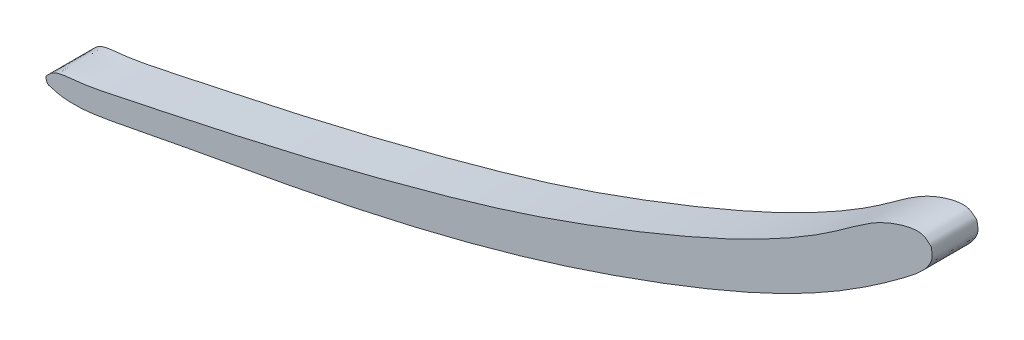
ISO-10303-21;
HEADER;
FILE_DESCRIPTION(('STEP AP214'),'2;1');
FILE_NAME('part.step','',(''),(''),'','','');
FILE_SCHEMA(('AUTOMOTIVE_DESIGN { 1 0 10303 214 1 1 1 1 }'));
ENDSEC;
DATA;
#1=APPLICATION_CONTEXT('core data for automotive mechanical design processes');
#2=APPLICATION_PROTOCOL_DEFINITION('international standard','automotive_design',2000,#1);
#3=PRODUCT_CONTEXT('',#1,'mechanical');
#4=PRODUCT('Part','Part','',(#3));
#5=PRODUCT_RELATED_PRODUCT_CATEGORY('part','',(#4));
#6=PRODUCT_DEFINITION_FORMATION('','',#4);
#7=PRODUCT_DEFINITION_CONTEXT('part definition',#1,'design');
#8=PRODUCT_DEFINITION('design','',#6,#7);
#9=PRODUCT_DEFINITION_SHAPE('','',#8);
#10=(LENGTH_UNIT() NAMED_UNIT(*) SI_UNIT(.MILLI.,.METRE.));
#11=(NAMED_UNIT(*) PLANE_ANGLE_UNIT() SI_UNIT($,.RADIAN.));
#12=(NAMED_UNIT(*) SI_UNIT($,.STERADIAN.) SOLID_ANGLE_UNIT());
#13=UNCERTAINTY_MEASURE_WITH_UNIT(LENGTH_MEASURE(1.E-05),#10,'distance_accuracy_value','');
#14=(GEOMETRIC_REPRESENTATION_CONTEXT(3) GLOBAL_UNCERTAINTY_ASSIGNED_CONTEXT((#13)) GLOBAL_UNIT_ASSIGNED_CONTEXT((#10,
#11,#12)) REPRESENTATION_CONTEXT('',''));
#15=CARTESIAN_POINT('',(0.,0.,0.));
#16=DIRECTION('',(0.,0.,1.));
#17=DIRECTION('',(1.,0.,0.));
#18=AXIS2_PLACEMENT_3D('',#15,#16,#17);
#19=CARTESIAN_POINT('',(91.603836258522,0.,260.));
#20=CARTESIAN_POINT('',(91.5553585518044,0.101876277070272,260.));
#21=CARTESIAN_POINT('',(91.4726470622969,0.178507328536229,260.));
#22=CARTESIAN_POINT('',(91.3025681478447,0.322014638656584,260.));
#23=CARTESIAN_POINT('',(91.2134167914587,0.388567661276925,260.));
#24=CARTESIAN_POINT('',(91.0380392953385,0.52537345109334,260.));
#25=CARTESIAN_POINT('',(90.9513061942287,0.594985025577056,260.));
#26=CARTESIAN_POINT('',(90.7727413402727,0.727759520871505,260.));
#27=CARTESIAN_POINT('',(90.6812637694731,0.791020923807146,260.));
#28=CARTESIAN_POINT('',(90.4934510878068,0.907163638833588,260.));
#29=CARTESIAN_POINT('',(90.3967791249805,0.959858927136439,260.));
#30=CARTESIAN_POINT('',(90.1936831480818,1.04629257377376,260.));
#31=CARTESIAN_POINT('',(90.0865895485178,1.08091350477458,260.));
#32=CARTESIAN_POINT('',(89.7612640002225,1.15975871633576,260.));
#33=CARTESIAN_POINT('',(89.5412703466494,1.17983449784633,260.));
#34=CARTESIAN_POINT('',(89.0982830990387,1.18864761593023,260.));
#35=CARTESIAN_POINT('',(88.8750801211929,1.17631649360539,260.));
#36=CARTESIAN_POINT('',(88.4350141945215,1.13596400587558,260.));
#37=CARTESIAN_POINT('',(88.2167930471731,1.10705660563916,260.));
#38=CARTESIAN_POINT('',(87.5669423457254,0.997141767804648,260.));
#39=CARTESIAN_POINT('',(87.1396612477242,0.895179083959574,260.));
#40=CARTESIAN_POINT('',(86.2908558710251,0.663511555977933,260.));
#41=CARTESIAN_POINT('',(85.8684856029018,0.531377867758049,260.));
#42=CARTESIAN_POINT('',(85.0365490111303,0.241981408095039,260.));
#43=CARTESIAN_POINT('',(84.6269614291081,0.0853232736908565,260.));
#44=CARTESIAN_POINT('',(83.4162546723911,-0.41849497743597,260.));
#45=CARTESIAN_POINT('',(82.6338967586556,-0.800820891518073,260.));
#46=CARTESIAN_POINT('',(80.3578358239991,-2.08090386429679,260.));
#47=CARTESIAN_POINT('',(78.9281907024888,-3.09890644147714,260.));
#48=CARTESIAN_POINT('',(76.7922315693229,-4.64109909780624,260.));
#49=CARTESIAN_POINT('',(76.0805254309011,-5.15567775084203,260.));
#50=CARTESIAN_POINT('',(74.647215014154,-6.16666507766017,260.));
#51=CARTESIAN_POINT('',(73.9262196535863,-6.66419153954495,260.));
#52=CARTESIAN_POINT('',(71.7415395794083,-8.11694734248332,260.));
#53=CARTESIAN_POINT('',(70.2577759456438,-9.03531788317729,260.));
#54=CARTESIAN_POINT('',(67.2539313541827,-10.8053913857253,260.));
#55=CARTESIAN_POINT('',(65.7339342782247,-11.6572483289806,260.));
#56=CARTESIAN_POINT('',(62.6673670106799,-13.312182044229,260.));
#57=CARTESIAN_POINT('',(61.1197352279837,-14.1133100573013,260.));
#58=CARTESIAN_POINT('',(57.99666019437,-15.6645126728546,260.));
#59=CARTESIAN_POINT('',(56.4217154344959,-16.4155023535223,260.));
#60=CARTESIAN_POINT('',(51.6656266322858,-18.6110975826145,260.));
#61=CARTESIAN_POINT('',(48.4540527677881,-20.0028662392139,260.));
#62=CARTESIAN_POINT('',(41.9868685724657,-22.6917688499962,260.));
#63=CARTESIAN_POINT('',(38.7321761446175,-23.985719953274,260.));
#64=CARTESIAN_POINT('',(32.1922284411193,-26.4901186043719,260.));
#65=CARTESIAN_POINT('',(28.9067714510636,-27.6996602800699,260.));
#66=CARTESIAN_POINT('',(22.29386927839,-30.003061811623,260.));
#67=CARTESIAN_POINT('',(18.9651562144002,-31.0951726735387,260.));
#68=CARTESIAN_POINT('',(12.2737520883989,-33.1585478402287,260.));
#69=CARTESIAN_POINT('',(8.9109287141975,-34.1330884779762,260.));
#70=CARTESIAN_POINT('',(2.16433546632563,-36.0122552211328,260.));
#71=CARTESIAN_POINT('',(-1.21823951831603,-36.9190487729415,260.));
#72=CARTESIAN_POINT('',(-7.99377008797927,-38.6904853774885,260.));
#73=CARTESIAN_POINT('',(-11.3878770980222,-39.5525132430664,260.));
#74=CARTESIAN_POINT('',(-18.1901195317249,-41.2201608464503,260.));
#75=CARTESIAN_POINT('',(-21.5983426849863,-42.0234444809931,260.));
#76=CARTESIAN_POINT('',(-28.4265325887207,-43.5795112385184,260.));
#77=CARTESIAN_POINT('',(-31.846677875781,-44.3317505363531,260.));
#78=CARTESIAN_POINT('',(-38.6914308882597,-45.8152862451121,260.));
#79=CARTESIAN_POINT('',(-42.1155779386966,-46.5488809566157,260.));
#80=CARTESIAN_POINT('',(-47.2537007801646,-47.6402778653854,260.));
#81=CARTESIAN_POINT('',(-48.9670775031458,-48.0009487385288,260.));
#82=CARTESIAN_POINT('',(-51.5388406702404,-48.5337516291482,260.));
#83=CARTESIAN_POINT('',(-52.3959335580973,-48.7121346944139,260.));
#84=CARTESIAN_POINT('',(-54.1125932882337,-49.0569202060549,260.));
#85=CARTESIAN_POINT('',(-54.9722590243259,-49.2202585098037,260.));
#86=CARTESIAN_POINT('',(-56.267430463406,-49.4258659589171,260.));
#87=CARTESIAN_POINT('',(-56.7000555426299,-49.4881646013151,260.));
#88=CARTESIAN_POINT('',(-57.567349859171,-49.5986153779034,260.));
#89=CARTESIAN_POINT('',(-58.002207816876,-49.6454614807633,260.));
#90=CARTESIAN_POINT('',(-58.8734421608677,-49.7286454667595,260.));
#91=CARTESIAN_POINT('',(-59.3094527937195,-49.7675145308184,260.));
#92=CARTESIAN_POINT('',(-60.1762826278142,-49.8811797382091,260.));
#93=CARTESIAN_POINT('',(-60.6081723134399,-49.9519039505424,260.));
#94=CARTESIAN_POINT('',(-61.2346779025629,-50.1278288154511,260.));
#95=CARTESIAN_POINT('',(-61.4399817291502,-50.1987998389035,260.));
#96=CARTESIAN_POINT('',(-61.739040541294,-50.3363190504988,260.));
#97=CARTESIAN_POINT('',(-61.8375466134454,-50.3876488901678,260.));
#98=CARTESIAN_POINT('',(-62.0259274634728,-50.5003672691711,260.));
#99=CARTESIAN_POINT('',(-62.1161193302079,-50.5622940988439,260.));
#100=CARTESIAN_POINT('',(-62.3782811667627,-50.7597900125803,260.));
#101=CARTESIAN_POINT('',(-62.5412291247319,-50.9085023512483,260.));
#102=CARTESIAN_POINT('',(-62.7780426113806,-51.1388034835041,260.));
#103=CARTESIAN_POINT('',(-62.8572479965772,-51.2153888116601,260.));
#104=CARTESIAN_POINT('',(-63.0046313265782,-51.3793807913512,260.));
#105=CARTESIAN_POINT('',(-63.075782681716,-51.4674500860984,260.));
#106=CARTESIAN_POINT('',(-63.1493668734531,-51.6735309900859,260.));
#107=CARTESIAN_POINT('',(-63.1453686816869,-51.7893203649949,260.));
#108=CARTESIAN_POINT('',(-63.1050802115201,-52.0045040235876,260.));
#109=CARTESIAN_POINT('',(-63.0728044747056,-52.1085069462364,260.));
#110=CARTESIAN_POINT('',(-62.9987354680191,-52.3136971848258,260.));
#111=CARTESIAN_POINT('',(-62.9554251314759,-52.4162843117688,260.));
#112=CARTESIAN_POINT('',(-62.8575639025905,-52.5480475956651,260.));
#113=CARTESIAN_POINT('',(-62.818407904005,-52.588062997603,260.));
#114=CARTESIAN_POINT('',(-62.7309934265951,-52.6535691633698,260.));
#115=CARTESIAN_POINT('',(-62.6809603164591,-52.6790654764105,260.));
#116=CARTESIAN_POINT('',(-62.5281491432617,-52.7367248404464,260.));
#117=CARTESIAN_POINT('',(-62.4213118287148,-52.7568258759354,260.));
#118=CARTESIAN_POINT('',(-62.2091023536071,-52.8024415491737,260.));
#119=CARTESIAN_POINT('',(-62.1034506466019,-52.8267966587884,260.));
#120=CARTESIAN_POINT('',(-61.7880793535659,-52.9072734819214,260.));
#121=CARTESIAN_POINT('',(-61.5791157508863,-52.9670432787308,260.));
#122=CARTESIAN_POINT('',(-61.1599200267986,-53.0805377147515,260.));
#123=CARTESIAN_POINT('',(-60.9491966074234,-53.1319210612623,260.));
#124=CARTESIAN_POINT('',(-60.5234131733857,-53.2140216014183,260.));
#125=CARTESIAN_POINT('',(-60.3086879846683,-53.2463344164454,260.));
#126=CARTESIAN_POINT('',(-59.6605392451748,-53.3243386049996,260.));
#127=CARTESIAN_POINT('',(-59.2258278689746,-53.3507904113598,260.));
#128=CARTESIAN_POINT('',(-57.9299010409486,-53.3915348914194,260.));
#129=CARTESIAN_POINT('',(-57.0700949668366,-53.3585259948166,260.));
#130=CARTESIAN_POINT('',(-55.3564726846759,-53.2055579118124,260.));
#131=CARTESIAN_POINT('',(-54.5025142183904,-53.0876637790834,260.));
#132=CARTESIAN_POINT('',(-52.7969514844708,-52.8177014181059,260.));
#133=CARTESIAN_POINT('',(-51.9456787675898,-52.6640178360964,260.));
#134=CARTESIAN_POINT('',(-49.397470783285,-52.1845733950714,260.));
#135=CARTESIAN_POINT('',(-47.7027390428147,-51.8435708649781,260.));
#136=CARTESIAN_POINT('',(-44.3097292692642,-51.1801721712808,260.));
#137=CARTESIAN_POINT('',(-42.6120397629021,-50.8546881790594,260.));
#138=CARTESIAN_POINT('',(-37.5142999296016,-49.9027452302228,260.));
#139=CARTESIAN_POINT('',(-34.1111928029328,-49.2927292443907,260.));
#140=CARTESIAN_POINT('',(-27.3076522263526,-48.0589398120599,260.));
#141=CARTESIAN_POINT('',(-23.9073483617419,-47.434593588802,260.));
#142=CARTESIAN_POINT('',(-13.7217019276446,-45.4839863093402,260.));
#143=CARTESIAN_POINT('',(-6.94989037654474,-44.0789196979219,260.));
#144=CARTESIAN_POINT('',(6.51934767856484,-40.9412584074609,260.));
#145=CARTESIAN_POINT('',(13.2170629941064,-39.2112977805989,260.));
#146=CARTESIAN_POINT('',(26.4935746536717,-35.336864175956,260.));
#147=CARTESIAN_POINT('',(33.0722954012052,-33.1905428370405,260.));
#148=CARTESIAN_POINT('',(42.8318843702323,-29.6878008941784,260.));
#149=CARTESIAN_POINT('',(46.0670644055581,-28.4745162783022,260.));
#150=CARTESIAN_POINT('',(52.4956612980625,-25.9420016374926,260.));
#151=CARTESIAN_POINT('',(55.6892706597814,-24.6232599607452,260.));
#152=CARTESIAN_POINT('',(62.0163099166235,-21.8331125024531,260.));
#153=CARTESIAN_POINT('',(65.148483938518,-20.3600071933936,260.));
#154=CARTESIAN_POINT('',(71.2945715196597,-17.1911347773583,260.));
#155=CARTESIAN_POINT('',(74.3116209595769,-15.4910144210044,260.));
#156=CARTESIAN_POINT('',(80.1838009414457,-11.8340938368323,260.));
#157=CARTESIAN_POINT('',(83.0426082798863,-9.87895734802884,260.));
#158=CARTESIAN_POINT('',(86.5267256046673,-7.31620974576604,260.));
#159=CARTESIAN_POINT('',(87.2194999297452,-6.79765962592061,260.));
#160=CARTESIAN_POINT('',(88.2403049087728,-5.99695055266286,260.));
#161=CARTESIAN_POINT('',(88.5768026775404,-5.72535447894867,260.));
#162=CARTESIAN_POINT('',(89.2371592200492,-5.1664311231995,260.));
#163=CARTESIAN_POINT('',(89.561650125352,-4.87981019837448,260.));
#164=CARTESIAN_POINT('',(90.1803367275688,-4.27983875891567,260.));
#165=CARTESIAN_POINT('',(90.475062460005,-3.96629575505175,260.));
#166=CARTESIAN_POINT('',(91.0140515070829,-3.29240761822194,260.));
#167=CARTESIAN_POINT('',(91.25800347187,-2.9272625751099,260.));
#168=CARTESIAN_POINT('',(91.5475017264035,-2.34612903035034,260.));
#169=CARTESIAN_POINT('',(91.6324902285912,-2.14559489830917,260.));
#170=CARTESIAN_POINT('',(91.7590293141033,-1.72742997018341,260.));
#171=CARTESIAN_POINT('',(91.8003203645713,-1.51477585399613,260.));
#172=CARTESIAN_POINT('',(91.8017586935442,-1.07628121548826,260.));
#173=CARTESIAN_POINT('',(91.7588449962305,-0.859549427443122,260.));
#174=CARTESIAN_POINT('',(91.7013661531637,-0.535919042209292,260.));
#175=CARTESIAN_POINT('',(91.6871063658217,-0.427378367320669,260.));
#176=CARTESIAN_POINT('',(91.6672772101172,-0.264355918697693,260.));
#177=CARTESIAN_POINT('',(91.6610859136702,-0.209836721273731,260.));
#178=CARTESIAN_POINT('',(91.6414124677293,-0.1026477030091,260.));
#179=CARTESIAN_POINT('',(91.6280751118808,-0.0509381385351262,260.));
#180=CARTESIAN_POINT('',(91.603836258522,0.,260.));
#181=B_SPLINE_CURVE_WITH_KNOTS('',3,(#19,#20,#21,#22,#23,#24,#25,#26,#27,#28,#29,#30,#31,#32,
#33,#34,#35,#36,#37,#38,#39,#40,#41,#42,#43,#44,#45,#46,#47,#48,#49,#50,#51,#52,#53,#54,#55,#56,
#57,#58,#59,#60,#61,#62,#63,#64,#65,#66,#67,#68,#69,#70,#71,#72,#73,#74,#75,#76,#77,#78,#79,#80,
#81,#82,#83,#84,#85,#86,#87,#88,#89,#90,#91,#92,#93,#94,#95,#96,#97,#98,#99,#100,#101,#102,#103,
#104,#105,#106,#107,#108,#109,#110,#111,#112,#113,#114,#115,#116,#117,#118,#119,#120,#121,#122,
#123,#124,#125,#126,#127,#128,#129,#130,#131,#132,#133,#134,#135,#136,#137,#138,#139,#140,#141,
#142,#143,#144,#145,#146,#147,#148,#149,#150,#151,#152,#153,#154,#155,#156,#157,#158,#159,#160,
#161,#162,#163,#164,#165,#166,#167,#168,#169,#170,#171,#172,#173,#174,#175,#176,#177,#178,#179,
#180),.UNSPECIFIED.,.T.,.F.,(4,2,2,2,2,2,2,2,2,2,2,2,2,2,2,2,2,2,2,2,2,2,2,2,2,2,2,2,2,2,2,2,2,
2,2,2,2,2,2,2,2,2,2,2,2,2,2,2,2,2,2,2,2,2,2,2,2,2,2,2,2,2,2,2,2,2,2,2,2,2,2,2,2,2,2,2,2,2,2,2,
4),(0.,0.000976562500000093,0.00195312500000019,0.00292968750000028,0.00390625000000037,
0.00488281250000046,0.00585937500000056,0.00781250000000063,0.00976562500000069,
0.0117187500000008,0.0156250000000009,0.019531250000001,0.0234375000000012,0.0312500000000013,
0.0468750000000016,0.0546875000000018,0.062500000000002,0.0781250000000023,0.0937500000000026,
0.109375000000003,0.125000000000003,0.156250000000004,0.187500000000005,0.218750000000005,
0.250000000000006,0.281250000000007,0.312500000000008,0.343750000000008,0.375000000000009,
0.40625000000001,0.437500000000011,0.453125000000011,0.460937500000011,0.468750000000011,
0.472656250000011,0.476562500000012,0.480468750000012,0.484375000000012,0.486328125000012,
0.487304687500012,0.488281250000012,0.490234375000012,0.491210937500012,0.492187500000012,
0.493164062500012,0.494140625000012,0.495117187500012,0.495605468750012,0.496093750000012,
0.497070312500012,0.498046875000012,0.500000000000012,0.501953125000012,0.503906250000012,
0.507812500000012,0.515625000000011,0.523437500000011,0.531250000000011,0.546875000000011,
0.562500000000011,0.59375000000001,0.625000000000009,0.687500000000008,0.750000000000006,
0.812500000000005,0.843750000000004,0.875000000000003,0.906250000000002,0.937500000000002,
0.968750000000001,0.976562500000001,0.980468750000001,0.984375000000001,0.98828125,0.9921875,
0.994140625,0.99609375,0.998046875,0.9990234375,0.99951171875,1.),.UNSPECIFIED.);
#182=DIRECTION('',(0.,0.,-1.));
#183=VECTOR('',#182,1.);
#184=SURFACE_OF_LINEAR_EXTRUSION('',#181,#183);
#185=CARTESIAN_POINT('',(91.603836258522,0.,260.));
#186=CARTESIAN_POINT('',(91.6280751118808,-0.0509381385351262,260.));
#187=CARTESIAN_POINT('',(91.6414124677293,-0.1026477030091,260.));
#188=CARTESIAN_POINT('',(91.6610859136702,-0.209836721273731,260.));
#189=CARTESIAN_POINT('',(91.6672772101172,-0.264355918697693,260.));
#190=CARTESIAN_POINT('',(91.6871063658217,-0.427378367320669,260.));
#191=CARTESIAN_POINT('',(91.7013661531637,-0.535919042209292,260.));
#192=CARTESIAN_POINT('',(91.7588449962305,-0.859549427443122,260.));
#193=CARTESIAN_POINT('',(91.8017586935442,-1.07628121548826,260.));
#194=CARTESIAN_POINT('',(91.8003203645713,-1.51477585399613,260.));
#195=CARTESIAN_POINT('',(91.7590293141033,-1.72742997018341,260.));
#196=CARTESIAN_POINT('',(91.6324902285912,-2.14559489830917,260.));
#197=CARTESIAN_POINT('',(91.5475017264035,-2.34612903035034,260.));
#198=CARTESIAN_POINT('',(91.25800347187,-2.9272625751099,260.));
#199=CARTESIAN_POINT('',(91.0140515070829,-3.29240761822194,260.));
#200=CARTESIAN_POINT('',(90.475062460005,-3.96629575505175,260.));
#201=CARTESIAN_POINT('',(90.1803367275688,-4.27983875891567,260.));
#202=CARTESIAN_POINT('',(89.561650125352,-4.87981019837448,260.));
#203=CARTESIAN_POINT('',(89.2371592200492,-5.1664311231995,260.));
#204=CARTESIAN_POINT('',(88.5768026775404,-5.72535447894867,260.));
#205=CARTESIAN_POINT('',(88.2403049087728,-5.99695055266286,260.));
#206=CARTESIAN_POINT('',(87.2194999297452,-6.79765962592061,260.));
#207=CARTESIAN_POINT('',(86.5267256046673,-7.31620974576604,260.));
#208=CARTESIAN_POINT('',(83.0426082798863,-9.87895734802884,260.));
#209=CARTESIAN_POINT('',(80.1838009414457,-11.8340938368323,260.));
#210=CARTESIAN_POINT('',(74.3116209595769,-15.4910144210044,260.));
#211=CARTESIAN_POINT('',(71.2945715196597,-17.1911347773583,260.));
#212=CARTESIAN_POINT('',(65.148483938518,-20.3600071933936,260.));
#213=CARTESIAN_POINT('',(62.0163099166235,-21.8331125024531,260.));
#214=CARTESIAN_POINT('',(55.6892706597814,-24.6232599607452,260.));
#215=CARTESIAN_POINT('',(52.4956612980625,-25.9420016374926,260.));
#216=CARTESIAN_POINT('',(46.0670644055581,-28.4745162783022,260.));
#217=CARTESIAN_POINT('',(42.8318843702323,-29.6878008941784,260.));
#218=CARTESIAN_POINT('',(33.0722954012052,-33.1905428370405,260.));
#219=CARTESIAN_POINT('',(26.4935746536717,-35.336864175956,260.));
#220=CARTESIAN_POINT('',(13.2170629941064,-39.2112977805989,260.));
#221=CARTESIAN_POINT('',(6.51934767856484,-40.9412584074609,260.));
#222=CARTESIAN_POINT('',(-6.94989037654474,-44.0789196979219,260.));
#223=CARTESIAN_POINT('',(-13.7217019276446,-45.4839863093402,260.));
#224=CARTESIAN_POINT('',(-23.9073483617419,-47.434593588802,260.));
#225=CARTESIAN_POINT('',(-27.3076522263526,-48.0589398120599,260.));
#226=CARTESIAN_POINT('',(-34.1111928029328,-49.2927292443907,260.));
#227=CARTESIAN_POINT('',(-37.5142999296016,-49.9027452302228,260.));
#228=CARTESIAN_POINT('',(-42.6120397629021,-50.8546881790594,260.));
#229=CARTESIAN_POINT('',(-44.3097292692642,-51.1801721712808,260.));
#230=CARTESIAN_POINT('',(-47.7027390428147,-51.8435708649781,260.));
#231=CARTESIAN_POINT('',(-49.397470783285,-52.1845733950714,260.));
#232=CARTESIAN_POINT('',(-51.9456787675898,-52.6640178360964,260.));
#233=CARTESIAN_POINT('',(-52.7969514844708,-52.8177014181059,260.));
#234=CARTESIAN_POINT('',(-54.5025142183904,-53.0876637790834,260.));
#235=CARTESIAN_POINT('',(-55.3564726846759,-53.2055579118124,260.));
#236=CARTESIAN_POINT('',(-57.0700949668366,-53.3585259948166,260.));
#237=CARTESIAN_POINT('',(-57.9299010409486,-53.3915348914194,260.));
#238=CARTESIAN_POINT('',(-59.2258278689746,-53.3507904113598,260.));
#239=CARTESIAN_POINT('',(-59.6605392451748,-53.3243386049996,260.));
#240=CARTESIAN_POINT('',(-60.3086879846683,-53.2463344164454,260.));
#241=CARTESIAN_POINT('',(-60.5234131733857,-53.2140216014183,260.));
#242=CARTESIAN_POINT('',(-60.9491966074234,-53.1319210612623,260.));
#243=CARTESIAN_POINT('',(-61.1599200267986,-53.0805377147515,260.));
#244=CARTESIAN_POINT('',(-61.5791157508863,-52.9670432787308,260.));
#245=CARTESIAN_POINT('',(-61.7880793535659,-52.9072734819214,260.));
#246=CARTESIAN_POINT('',(-62.1034506466019,-52.8267966587884,260.));
#247=CARTESIAN_POINT('',(-62.2091023536071,-52.8024415491737,260.));
#248=CARTESIAN_POINT('',(-62.4213118287148,-52.7568258759354,260.));
#249=CARTESIAN_POINT('',(-62.5281491432617,-52.7367248404464,260.));
#250=CARTESIAN_POINT('',(-62.6809603164591,-52.6790654764105,260.));
#251=CARTESIAN_POINT('',(-62.7309934265951,-52.6535691633698,260.));
#252=CARTESIAN_POINT('',(-62.818407904005,-52.588062997603,260.));
#253=CARTESIAN_POINT('',(-62.8575639025905,-52.5480475956651,260.));
#254=CARTESIAN_POINT('',(-62.9554251314759,-52.4162843117688,260.));
#255=CARTESIAN_POINT('',(-62.9987354680191,-52.3136971848258,260.));
#256=CARTESIAN_POINT('',(-63.0728044747056,-52.1085069462364,260.));
#257=CARTESIAN_POINT('',(-63.1050802115201,-52.0045040235876,260.));
#258=CARTESIAN_POINT('',(-63.1453686816869,-51.7893203649949,260.));
#259=CARTESIAN_POINT('',(-63.1493668734531,-51.6735309900859,260.));
#260=CARTESIAN_POINT('',(-63.075782681716,-51.4674500860984,260.));
#261=CARTESIAN_POINT('',(-63.0046313265782,-51.3793807913512,260.));
#262=CARTESIAN_POINT('',(-62.8572479965772,-51.2153888116601,260.));
#263=CARTESIAN_POINT('',(-62.7780426113806,-51.1388034835041,260.));
#264=CARTESIAN_POINT('',(-62.5412291247319,-50.9085023512483,260.));
#265=CARTESIAN_POINT('',(-62.3782811667627,-50.7597900125803,260.));
#266=CARTESIAN_POINT('',(-62.1161193302079,-50.5622940988439,260.));
#267=CARTESIAN_POINT('',(-62.0259274634728,-50.5003672691711,260.));
#268=CARTESIAN_POINT('',(-61.8375466134454,-50.3876488901678,260.));
#269=CARTESIAN_POINT('',(-61.739040541294,-50.3363190504988,260.));
#270=CARTESIAN_POINT('',(-61.4399817291502,-50.1987998389035,260.));
#271=CARTESIAN_POINT('',(-61.2346779025629,-50.1278288154511,260.));
#272=CARTESIAN_POINT('',(-60.6081723134399,-49.9519039505424,260.));
#273=CARTESIAN_POINT('',(-60.1762826278142,-49.8811797382091,260.));
#274=CARTESIAN_POINT('',(-59.3094527937195,-49.7675145308184,260.));
#275=CARTESIAN_POINT('',(-58.8734421608677,-49.7286454667595,260.));
#276=CARTESIAN_POINT('',(-58.002207816876,-49.6454614807633,260.));
#277=CARTESIAN_POINT('',(-57.567349859171,-49.5986153779034,260.));
#278=CARTESIAN_POINT('',(-56.7000555426299,-49.4881646013151,260.));
#279=CARTESIAN_POINT('',(-56.267430463406,-49.4258659589171,260.));
#280=CARTESIAN_POINT('',(-54.9722590243259,-49.2202585098037,260.));
#281=CARTESIAN_POINT('',(-54.1125932882337,-49.0569202060549,260.));
#282=CARTESIAN_POINT('',(-52.3959335580973,-48.7121346944139,260.));
#283=CARTESIAN_POINT('',(-51.5388406702404,-48.5337516291482,260.));
#284=CARTESIAN_POINT('',(-48.9670775031458,-48.0009487385288,260.));
#285=CARTESIAN_POINT('',(-47.2537007801646,-47.6402778653854,260.));
#286=CARTESIAN_POINT('',(-42.1155779386966,-46.5488809566157,260.));
#287=CARTESIAN_POINT('',(-38.6914308882597,-45.8152862451121,260.));
#288=CARTESIAN_POINT('',(-31.846677875781,-44.3317505363531,260.));
#289=CARTESIAN_POINT('',(-28.4265325887207,-43.5795112385184,260.));
#290=CARTESIAN_POINT('',(-21.5983426849863,-42.0234444809931,260.));
#291=CARTESIAN_POINT('',(-18.1901195317249,-41.2201608464503,260.));
#292=CARTESIAN_POINT('',(-11.3878770980222,-39.5525132430664,260.));
#293=CARTESIAN_POINT('',(-7.99377008797927,-38.6904853774885,260.));
#294=CARTESIAN_POINT('',(-1.21823951831603,-36.9190487729415,260.));
#295=CARTESIAN_POINT('',(2.16433546632563,-36.0122552211328,260.));
#296=CARTESIAN_POINT('',(8.9109287141975,-34.1330884779762,260.));
#297=CARTESIAN_POINT('',(12.2737520883989,-33.1585478402287,260.));
#298=CARTESIAN_POINT('',(18.9651562144002,-31.0951726735387,260.));
#299=CARTESIAN_POINT('',(22.29386927839,-30.003061811623,260.));
#300=CARTESIAN_POINT('',(28.9067714510636,-27.6996602800699,260.));
#301=CARTESIAN_POINT('',(32.1922284411193,-26.4901186043719,260.));
#302=CARTESIAN_POINT('',(38.7321761446175,-23.985719953274,260.));
#303=CARTESIAN_POINT('',(41.9868685724657,-22.6917688499962,260.));
#304=CARTESIAN_POINT('',(48.4540527677881,-20.0028662392139,260.));
#305=CARTESIAN_POINT('',(51.6656266322858,-18.6110975826145,260.));
#306=CARTESIAN_POINT('',(56.4217154344959,-16.4155023535223,260.));
#307=CARTESIAN_POINT('',(57.99666019437,-15.6645126728546,260.));
#308=CARTESIAN_POINT('',(61.1197352279837,-14.1133100573013,260.));
#309=CARTESIAN_POINT('',(62.6673670106799,-13.312182044229,260.));
#310=CARTESIAN_POINT('',(65.7339342782247,-11.6572483289806,260.));
#311=CARTESIAN_POINT('',(67.2539313541827,-10.8053913857253,260.));
#312=CARTESIAN_POINT('',(70.2577759456438,-9.03531788317729,260.));
#313=CARTESIAN_POINT('',(71.7415395794083,-8.11694734248332,260.));
#314=CARTESIAN_POINT('',(73.9262196535863,-6.66419153954495,260.));
#315=CARTESIAN_POINT('',(74.647215014154,-6.16666507766017,260.));
#316=CARTESIAN_POINT('',(76.0805254309011,-5.15567775084203,260.));
#317=CARTESIAN_POINT('',(76.7922315693229,-4.64109909780624,260.));
#318=CARTESIAN_POINT('',(78.9281907024888,-3.09890644147714,260.));
#319=CARTESIAN_POINT('',(80.3578358239991,-2.08090386429679,260.));
#320=CARTESIAN_POINT('',(82.6338967586556,-0.800820891518073,260.));
#321=CARTESIAN_POINT('',(83.4162546723911,-0.41849497743597,260.));
#322=CARTESIAN_POINT('',(84.6269614291081,0.0853232736908565,260.));
#323=CARTESIAN_POINT('',(85.0365490111303,0.241981408095039,260.));
#324=CARTESIAN_POINT('',(85.8684856029018,0.531377867758049,260.));
#325=CARTESIAN_POINT('',(86.2908558710251,0.663511555977933,260.));
#326=CARTESIAN_POINT('',(87.1396612477242,0.895179083959574,260.));
#327=CARTESIAN_POINT('',(87.5669423457254,0.997141767804648,260.));
#328=CARTESIAN_POINT('',(88.2167930471731,1.10705660563916,260.));
#329=CARTESIAN_POINT('',(88.4350141945215,1.13596400587558,260.));
#330=CARTESIAN_POINT('',(88.8750801211929,1.17631649360539,260.));
#331=CARTESIAN_POINT('',(89.0982830990387,1.18864761593023,260.));
#332=CARTESIAN_POINT('',(89.5412703466494,1.17983449784633,260.));
#333=CARTESIAN_POINT('',(89.7612640002225,1.15975871633576,260.));
#334=CARTESIAN_POINT('',(90.0865895485178,1.08091350477458,260.));
#335=CARTESIAN_POINT('',(90.1936831480818,1.04629257377376,260.));
#336=CARTESIAN_POINT('',(90.3967791249805,0.959858927136439,260.));
#337=CARTESIAN_POINT('',(90.4934510878068,0.907163638833588,260.));
#338=CARTESIAN_POINT('',(90.6812637694731,0.791020923807146,260.));
#339=CARTESIAN_POINT('',(90.7727413402727,0.727759520871505,260.));
#340=CARTESIAN_POINT('',(90.9513061942287,0.594985025577056,260.));
#341=CARTESIAN_POINT('',(91.0380392953385,0.52537345109334,260.));
#342=CARTESIAN_POINT('',(91.2134167914587,0.388567661276925,260.));
#343=CARTESIAN_POINT('',(91.3025681478447,0.322014638656584,260.));
#344=CARTESIAN_POINT('',(91.4726470622969,0.178507328536229,260.));
#345=CARTESIAN_POINT('',(91.5553585518044,0.101876277070272,260.));
#346=CARTESIAN_POINT('',(91.603836258522,0.,260.));
#347=B_SPLINE_CURVE_WITH_KNOTS('',3,(#185,#186,#187,#188,#189,#190,#191,#192,#193,#194,#195,
#196,#197,#198,#199,#200,#201,#202,#203,#204,#205,#206,#207,#208,#209,#210,#211,#212,#213,#214,
#215,#216,#217,#218,#219,#220,#221,#222,#223,#224,#225,#226,#227,#228,#229,#230,#231,#232,#233,
#234,#235,#236,#237,#238,#239,#240,#241,#242,#243,#244,#245,#246,#247,#248,#249,#250,#251,#252,
#253,#254,#255,#256,#257,#258,#259,#260,#261,#262,#263,#264,#265,#266,#267,#268,#269,#270,#271,
#272,#273,#274,#275,#276,#277,#278,#279,#280,#281,#282,#283,#284,#285,#286,#287,#288,#289,#290,
#291,#292,#293,#294,#295,#296,#297,#298,#299,#300,#301,#302,#303,#304,#305,#306,#307,#308,#309,
#310,#311,#312,#313,#314,#315,#316,#317,#318,#319,#320,#321,#322,#323,#324,#325,#326,#327,#328,
#329,#330,#331,#332,#333,#334,#335,#336,#337,#338,#339,#340,#341,#342,#343,#344,#345,#346),
.UNSPECIFIED.,.T.,.F.,(4,2,2,2,2,2,2,2,2,2,2,2,2,2,2,2,2,2,2,2,2,2,2,2,2,2,2,2,2,2,2,2,2,2,2,2,
2,2,2,2,2,2,2,2,2,2,2,2,2,2,2,2,2,2,2,2,2,2,2,2,2,2,2,2,2,2,2,2,2,2,2,2,2,2,2,2,2,2,2,2,4),(0.,
0.000488281249999778,0.000976562499999778,0.00195312499999978,0.00390624999999967,
0.00585937499999967,0.00781249999999967,0.0117187499999996,0.0156249999999994,
0.0195312499999994,0.0234374999999993,0.0312499999999992,0.0624999999999984,0.0937499999999976,
0.124999999999997,0.156249999999996,0.187499999999995,0.249999999999994,0.312499999999992,
0.374999999999991,0.40624999999999,0.437499999999989,0.453124999999989,0.468749999999989,
0.476562499999989,0.484374999999989,0.492187499999988,0.496093749999988,0.498046874999988,
0.499999999999988,0.501953124999988,0.502929687499988,0.503906249999988,0.504394531249988,
0.504882812499988,0.505859374999988,0.506835937499988,0.507812499999988,0.508789062499988,
0.509765624999988,0.511718749999988,0.512695312499988,0.513671874999988,0.515624999999988,
0.519531249999988,0.523437499999988,0.527343749999989,0.531249999999989,0.539062499999989,
0.546874999999989,0.562499999999989,0.59374999999999,0.624999999999991,0.656249999999992,
0.687499999999992,0.718749999999993,0.749999999999994,0.781249999999995,0.812499999999995,
0.843749999999996,0.874999999999997,0.890624999999997,0.906249999999997,0.921874999999998,
0.937499999999998,0.945312499999998,0.953124999999998,0.968749999999999,0.976562499999999,
0.980468749999999,0.984374999999999,0.988281249999999,0.990234374999999,0.992187499999999,
0.994140624999999,0.9951171875,0.99609375,0.9970703125,0.998046875,0.9990234375,1.),.UNSPECIFIED.);
#348=CARTESIAN_POINT('',(91.603836258522,0.,260.));
#349=VERTEX_POINT('',#348);
#350=EDGE_CURVE('E10',#349,#349,#347,.F.);
#351=ORIENTED_EDGE('',*,*,#350,.F.);
#352=EDGE_LOOP('',(#351));
#353=FACE_BOUND('',#352,.T.);
#354=CARTESIAN_POINT('',(91.603836258522,0.,252.));
#355=CARTESIAN_POINT('',(91.5553585518044,0.101876277070272,252.));
#356=CARTESIAN_POINT('',(91.4726470622969,0.178507328536229,252.));
#357=CARTESIAN_POINT('',(91.3025681478447,0.322014638656584,252.));
#358=CARTESIAN_POINT('',(91.2134167914587,0.388567661276925,252.));
#359=CARTESIAN_POINT('',(91.0380392953385,0.52537345109334,252.));
#360=CARTESIAN_POINT('',(90.9513061942287,0.594985025577056,252.));
#361=CARTESIAN_POINT('',(90.7727413402727,0.727759520871505,252.));
#362=CARTESIAN_POINT('',(90.6812637694731,0.791020923807146,252.));
#363=CARTESIAN_POINT('',(90.4934510878068,0.907163638833588,252.));
#364=CARTESIAN_POINT('',(90.3967791249805,0.959858927136439,252.));
#365=CARTESIAN_POINT('',(90.1936831480818,1.04629257377376,252.));
#366=CARTESIAN_POINT('',(90.0865895485178,1.08091350477458,252.));
#367=CARTESIAN_POINT('',(89.7612640002225,1.15975871633576,252.));
#368=CARTESIAN_POINT('',(89.5412703466494,1.17983449784633,252.));
#369=CARTESIAN_POINT('',(89.0982830990387,1.18864761593023,252.));
#370=CARTESIAN_POINT('',(88.8750801211929,1.17631649360539,252.));
#371=CARTESIAN_POINT('',(88.4350141945215,1.13596400587558,252.));
#372=CARTESIAN_POINT('',(88.2167930471731,1.10705660563916,252.));
#373=CARTESIAN_POINT('',(87.5669423457254,0.997141767804648,252.));
#374=CARTESIAN_POINT('',(87.1396612477242,0.895179083959574,252.));
#375=CARTESIAN_POINT('',(86.2908558710251,0.663511555977933,252.));
#376=CARTESIAN_POINT('',(85.8684856029018,0.531377867758049,252.));
#377=CARTESIAN_POINT('',(85.0365490111303,0.241981408095039,252.));
#378=CARTESIAN_POINT('',(84.6269614291081,0.0853232736908565,252.));
#379=CARTESIAN_POINT('',(83.4162546723911,-0.41849497743597,252.));
#380=CARTESIAN_POINT('',(82.6338967586556,-0.800820891518073,252.));
#381=CARTESIAN_POINT('',(80.3578358239991,-2.08090386429679,252.));
#382=CARTESIAN_POINT('',(78.9281907024888,-3.09890644147714,252.));
#383=CARTESIAN_POINT('',(76.7922315693229,-4.64109909780624,252.));
#384=CARTESIAN_POINT('',(76.0805254309011,-5.15567775084203,252.));
#385=CARTESIAN_POINT('',(74.647215014154,-6.16666507766017,252.));
#386=CARTESIAN_POINT('',(73.9262196535863,-6.66419153954495,252.));
#387=CARTESIAN_POINT('',(71.7415395794083,-8.11694734248332,252.));
#388=CARTESIAN_POINT('',(70.2577759456438,-9.03531788317729,252.));
#389=CARTESIAN_POINT('',(67.2539313541827,-10.8053913857253,252.));
#390=CARTESIAN_POINT('',(65.7339342782247,-11.6572483289806,252.));
#391=CARTESIAN_POINT('',(62.6673670106799,-13.312182044229,252.));
#392=CARTESIAN_POINT('',(61.1197352279837,-14.1133100573013,252.));
#393=CARTESIAN_POINT('',(57.99666019437,-15.6645126728546,252.));
#394=CARTESIAN_POINT('',(56.4217154344959,-16.4155023535223,252.));
#395=CARTESIAN_POINT('',(51.6656266322858,-18.6110975826145,252.));
#396=CARTESIAN_POINT('',(48.4540527677881,-20.0028662392139,252.));
#397=CARTESIAN_POINT('',(41.9868685724657,-22.6917688499962,252.));
#398=CARTESIAN_POINT('',(38.7321761446175,-23.985719953274,252.));
#399=CARTESIAN_POINT('',(32.1922284411193,-26.4901186043719,252.));
#400=CARTESIAN_POINT('',(28.9067714510636,-27.6996602800699,252.));
#401=CARTESIAN_POINT('',(22.29386927839,-30.003061811623,252.));
#402=CARTESIAN_POINT('',(18.9651562144002,-31.0951726735387,252.));
#403=CARTESIAN_POINT('',(12.2737520883989,-33.1585478402287,252.));
#404=CARTESIAN_POINT('',(8.9109287141975,-34.1330884779762,252.));
#405=CARTESIAN_POINT('',(2.16433546632563,-36.0122552211328,252.));
#406=CARTESIAN_POINT('',(-1.21823951831603,-36.9190487729415,252.));
#407=CARTESIAN_POINT('',(-7.99377008797927,-38.6904853774885,252.));
#408=CARTESIAN_POINT('',(-11.3878770980222,-39.5525132430664,252.));
#409=CARTESIAN_POINT('',(-18.1901195317249,-41.2201608464503,252.));
#410=CARTESIAN_POINT('',(-21.5983426849863,-42.0234444809931,252.));
#411=CARTESIAN_POINT('',(-28.4265325887207,-43.5795112385184,252.));
#412=CARTESIAN_POINT('',(-31.846677875781,-44.3317505363531,252.));
#413=CARTESIAN_POINT('',(-38.6914308882597,-45.8152862451121,252.));
#414=CARTESIAN_POINT('',(-42.1155779386966,-46.5488809566157,252.));
#415=CARTESIAN_POINT('',(-47.2537007801646,-47.6402778653854,252.));
#416=CARTESIAN_POINT('',(-48.9670775031458,-48.0009487385288,252.));
#417=CARTESIAN_POINT('',(-51.5388406702404,-48.5337516291482,252.));
#418=CARTESIAN_POINT('',(-52.3959335580973,-48.7121346944139,252.));
#419=CARTESIAN_POINT('',(-54.1125932882337,-49.0569202060549,252.));
#420=CARTESIAN_POINT('',(-54.9722590243259,-49.2202585098037,252.));
#421=CARTESIAN_POINT('',(-56.267430463406,-49.4258659589171,252.));
#422=CARTESIAN_POINT('',(-56.7000555426299,-49.4881646013151,252.));
#423=CARTESIAN_POINT('',(-57.567349859171,-49.5986153779034,252.));
#424=CARTESIAN_POINT('',(-58.002207816876,-49.6454614807633,252.));
#425=CARTESIAN_POINT('',(-58.8734421608677,-49.7286454667595,252.));
#426=CARTESIAN_POINT('',(-59.3094527937195,-49.7675145308184,252.));
#427=CARTESIAN_POINT('',(-60.1762826278142,-49.8811797382091,252.));
#428=CARTESIAN_POINT('',(-60.6081723134399,-49.9519039505424,252.));
#429=CARTESIAN_POINT('',(-61.2346779025629,-50.1278288154511,252.));
#430=CARTESIAN_POINT('',(-61.4399817291502,-50.1987998389035,252.));
#431=CARTESIAN_POINT('',(-61.739040541294,-50.3363190504988,252.));
#432=CARTESIAN_POINT('',(-61.8375466134454,-50.3876488901678,252.));
#433=CARTESIAN_POINT('',(-62.0259274634728,-50.5003672691711,252.));
#434=CARTESIAN_POINT('',(-62.1161193302079,-50.5622940988439,252.));
#435=CARTESIAN_POINT('',(-62.3782811667627,-50.7597900125803,252.));
#436=CARTESIAN_POINT('',(-62.5412291247319,-50.9085023512483,252.));
#437=CARTESIAN_POINT('',(-62.7780426113806,-51.1388034835041,252.));
#438=CARTESIAN_POINT('',(-62.8572479965772,-51.2153888116601,252.));
#439=CARTESIAN_POINT('',(-63.0046313265782,-51.3793807913512,252.));
#440=CARTESIAN_POINT('',(-63.075782681716,-51.4674500860984,252.));
#441=CARTESIAN_POINT('',(-63.1493668734531,-51.6735309900859,252.));
#442=CARTESIAN_POINT('',(-63.1453686816869,-51.7893203649949,252.));
#443=CARTESIAN_POINT('',(-63.1050802115201,-52.0045040235876,252.));
#444=CARTESIAN_POINT('',(-63.0728044747056,-52.1085069462364,252.));
#445=CARTESIAN_POINT('',(-62.9987354680191,-52.3136971848258,252.));
#446=CARTESIAN_POINT('',(-62.9554251314759,-52.4162843117688,252.));
#447=CARTESIAN_POINT('',(-62.8575639025905,-52.5480475956651,252.));
#448=CARTESIAN_POINT('',(-62.818407904005,-52.588062997603,252.));
#449=CARTESIAN_POINT('',(-62.7309934265951,-52.6535691633698,252.));
#450=CARTESIAN_POINT('',(-62.6809603164591,-52.6790654764105,252.));
#451=CARTESIAN_POINT('',(-62.5281491432617,-52.7367248404464,252.));
#452=CARTESIAN_POINT('',(-62.4213118287148,-52.7568258759354,252.));
#453=CARTESIAN_POINT('',(-62.2091023536071,-52.8024415491737,252.));
#454=CARTESIAN_POINT('',(-62.1034506466019,-52.8267966587884,252.));
#455=CARTESIAN_POINT('',(-61.7880793535659,-52.9072734819214,252.));
#456=CARTESIAN_POINT('',(-61.5791157508863,-52.9670432787308,252.));
#457=CARTESIAN_POINT('',(-61.1599200267986,-53.0805377147515,252.));
#458=CARTESIAN_POINT('',(-60.9491966074234,-53.1319210612623,252.));
#459=CARTESIAN_POINT('',(-60.5234131733857,-53.2140216014183,252.));
#460=CARTESIAN_POINT('',(-60.3086879846683,-53.2463344164454,252.));
#461=CARTESIAN_POINT('',(-59.6605392451748,-53.3243386049996,252.));
#462=CARTESIAN_POINT('',(-59.2258278689746,-53.3507904113598,252.));
#463=CARTESIAN_POINT('',(-57.9299010409486,-53.3915348914194,252.));
#464=CARTESIAN_POINT('',(-57.0700949668366,-53.3585259948166,252.));
#465=CARTESIAN_POINT('',(-55.3564726846759,-53.2055579118124,252.));
#466=CARTESIAN_POINT('',(-54.5025142183904,-53.0876637790834,252.));
#467=CARTESIAN_POINT('',(-52.7969514844708,-52.8177014181059,252.));
#468=CARTESIAN_POINT('',(-51.9456787675898,-52.6640178360964,252.));
#469=CARTESIAN_POINT('',(-49.397470783285,-52.1845733950714,252.));
#470=CARTESIAN_POINT('',(-47.7027390428147,-51.8435708649781,252.));
#471=CARTESIAN_POINT('',(-44.3097292692642,-51.1801721712808,252.));
#472=CARTESIAN_POINT('',(-42.6120397629021,-50.8546881790594,252.));
#473=CARTESIAN_POINT('',(-37.5142999296016,-49.9027452302228,252.));
#474=CARTESIAN_POINT('',(-34.1111928029328,-49.2927292443907,252.));
#475=CARTESIAN_POINT('',(-27.3076522263526,-48.0589398120599,252.));
#476=CARTESIAN_POINT('',(-23.9073483617419,-47.434593588802,252.));
#477=CARTESIAN_POINT('',(-13.7217019276446,-45.4839863093402,252.));
#478=CARTESIAN_POINT('',(-6.94989037654474,-44.0789196979219,252.));
#479=CARTESIAN_POINT('',(6.51934767856484,-40.9412584074609,252.));
#480=CARTESIAN_POINT('',(13.2170629941064,-39.2112977805989,252.));
#481=CARTESIAN_POINT('',(26.4935746536717,-35.336864175956,252.));
#482=CARTESIAN_POINT('',(33.0722954012052,-33.1905428370405,252.));
#483=CARTESIAN_POINT('',(42.8318843702323,-29.6878008941784,252.));
#484=CARTESIAN_POINT('',(46.0670644055581,-28.4745162783022,252.));
#485=CARTESIAN_POINT('',(52.4956612980625,-25.9420016374926,252.));
#486=CARTESIAN_POINT('',(55.6892706597814,-24.6232599607452,252.));
#487=CARTESIAN_POINT('',(62.0163099166235,-21.8331125024531,252.));
#488=CARTESIAN_POINT('',(65.148483938518,-20.3600071933936,252.));
#489=CARTESIAN_POINT('',(71.2945715196597,-17.1911347773583,252.));
#490=CARTESIAN_POINT('',(74.3116209595769,-15.4910144210044,252.));
#491=CARTESIAN_POINT('',(80.1838009414457,-11.8340938368323,252.));
#492=CARTESIAN_POINT('',(83.0426082798863,-9.87895734802884,252.));
#493=CARTESIAN_POINT('',(86.5267256046673,-7.31620974576604,252.));
#494=CARTESIAN_POINT('',(87.2194999297452,-6.79765962592061,252.));
#495=CARTESIAN_POINT('',(88.2403049087728,-5.99695055266286,252.));
#496=CARTESIAN_POINT('',(88.5768026775404,-5.72535447894867,252.));
#497=CARTESIAN_POINT('',(89.2371592200492,-5.1664311231995,252.));
#498=CARTESIAN_POINT('',(89.561650125352,-4.87981019837448,252.));
#499=CARTESIAN_POINT('',(90.1803367275688,-4.27983875891567,252.));
#500=CARTESIAN_POINT('',(90.475062460005,-3.96629575505175,252.));
#501=CARTESIAN_POINT('',(91.0140515070829,-3.29240761822194,252.));
#502=CARTESIAN_POINT('',(91.25800347187,-2.9272625751099,252.));
#503=CARTESIAN_POINT('',(91.5475017264035,-2.34612903035034,252.));
#504=CARTESIAN_POINT('',(91.6324902285912,-2.14559489830917,252.));
#505=CARTESIAN_POINT('',(91.7590293141033,-1.72742997018341,252.));
#506=CARTESIAN_POINT('',(91.8003203645713,-1.51477585399613,252.));
#507=CARTESIAN_POINT('',(91.8017586935442,-1.07628121548826,252.));
#508=CARTESIAN_POINT('',(91.7588449962305,-0.859549427443122,252.));
#509=CARTESIAN_POINT('',(91.7013661531637,-0.535919042209292,252.));
#510=CARTESIAN_POINT('',(91.6871063658217,-0.427378367320669,252.));
#511=CARTESIAN_POINT('',(91.6672772101172,-0.264355918697693,252.));
#512=CARTESIAN_POINT('',(91.6610859136702,-0.209836721273731,252.));
#513=CARTESIAN_POINT('',(91.6414124677293,-0.1026477030091,252.));
#514=CARTESIAN_POINT('',(91.6280751118808,-0.0509381385351262,252.));
#515=CARTESIAN_POINT('',(91.603836258522,0.,252.));
#516=B_SPLINE_CURVE_WITH_KNOTS('',3,(#354,#355,#356,#357,#358,#359,#360,#361,#362,#363,#364,
#365,#366,#367,#368,#369,#370,#371,#372,#373,#374,#375,#376,#377,#378,#379,#380,#381,#382,#383,
#384,#385,#386,#387,#388,#389,#390,#391,#392,#393,#394,#395,#396,#397,#398,#399,#400,#401,#402,
#403,#404,#405,#406,#407,#408,#409,#410,#411,#412,#413,#414,#415,#416,#417,#418,#419,#420,#421,
#422,#423,#424,#425,#426,#427,#428,#429,#430,#431,#432,#433,#434,#435,#436,#437,#438,#439,#440,
#441,#442,#443,#444,#445,#446,#447,#448,#449,#450,#451,#452,#453,#454,#455,#456,#457,#458,#459,
#460,#461,#462,#463,#464,#465,#466,#467,#468,#469,#470,#471,#472,#473,#474,#475,#476,#477,#478,
#479,#480,#481,#482,#483,#484,#485,#486,#487,#488,#489,#490,#491,#492,#493,#494,#495,#496,#497,
#498,#499,#500,#501,#502,#503,#504,#505,#506,#507,#508,#509,#510,#511,#512,#513,#514,#515),
.UNSPECIFIED.,.T.,.F.,(4,2,2,2,2,2,2,2,2,2,2,2,2,2,2,2,2,2,2,2,2,2,2,2,2,2,2,2,2,2,2,2,2,2,2,2,
2,2,2,2,2,2,2,2,2,2,2,2,2,2,2,2,2,2,2,2,2,2,2,2,2,2,2,2,2,2,2,2,2,2,2,2,2,2,2,2,2,2,2,2,4),(0.,
0.000976562500000093,0.00195312500000019,0.00292968750000028,0.00390625000000037,
0.00488281250000046,0.00585937500000056,0.00781250000000063,0.00976562500000069,
0.0117187500000008,0.0156250000000009,0.019531250000001,0.0234375000000012,0.0312500000000013,
0.0468750000000016,0.0546875000000018,0.062500000000002,0.0781250000000023,0.0937500000000026,
0.109375000000003,0.125000000000003,0.156250000000004,0.187500000000005,0.218750000000005,
0.250000000000006,0.281250000000007,0.312500000000008,0.343750000000008,0.375000000000009,
0.40625000000001,0.437500000000011,0.453125000000011,0.460937500000011,0.468750000000011,
0.472656250000011,0.476562500000012,0.480468750000012,0.484375000000012,0.486328125000012,
0.487304687500012,0.488281250000012,0.490234375000012,0.491210937500012,0.492187500000012,
0.493164062500012,0.494140625000012,0.495117187500012,0.495605468750012,0.496093750000012,
0.497070312500012,0.498046875000012,0.500000000000012,0.501953125000012,0.503906250000012,
0.507812500000012,0.515625000000011,0.523437500000011,0.531250000000011,0.546875000000011,
0.562500000000011,0.59375000000001,0.625000000000009,0.687500000000008,0.750000000000006,
0.812500000000005,0.843750000000004,0.875000000000003,0.906250000000002,0.937500000000002,
0.968750000000001,0.976562500000001,0.980468750000001,0.984375000000001,0.98828125,0.9921875,
0.994140625,0.99609375,0.998046875,0.9990234375,0.99951171875,1.),.UNSPECIFIED.);
#517=CARTESIAN_POINT('',(91.603836258522,0.,252.));
#518=VERTEX_POINT('',#517);
#519=EDGE_CURVE('E38',#518,#518,#516,.T.);
#520=ORIENTED_EDGE('',*,*,#519,.T.);
#521=EDGE_LOOP('',(#520));
#522=FACE_BOUND('',#521,.T.);
#523=ADVANCED_FACE('F28',(#353,#522),#184,.F.);
#524=CARTESIAN_POINT('',(-61.3695178888462,-53.0237904967401,260.));
#525=DIRECTION('',(0.,0.,-1.));
#526=DIRECTION('',(-1.,0.,0.));
#527=AXIS2_PLACEMENT_3D('',#524,#525,#526);
#528=PLANE('',#527);
#529=ORIENTED_EDGE('',*,*,#350,.T.);
#530=EDGE_LOOP('',(#529));
#531=FACE_BOUND('',#530,.T.);
#532=ADVANCED_FACE('F69',(#531),#528,.F.);
#533=CARTESIAN_POINT('',(-61.3695178888462,-53.0237904967401,252.));
#534=DIRECTION('',(0.,0.,-1.));
#535=DIRECTION('',(-1.,0.,0.));
#536=AXIS2_PLACEMENT_3D('',#533,#534,#535);
#537=PLANE('',#536);
#538=ORIENTED_EDGE('',*,*,#519,.F.);
#539=EDGE_LOOP('',(#538));
#540=FACE_BOUND('',#539,.T.);
#541=ADVANCED_FACE('F77',(#540),#537,.T.);
#542=CLOSED_SHELL('',(#523,#532,#541));
#543=MANIFOLD_SOLID_BREP('B2',#542);
#544=ADVANCED_BREP_SHAPE_REPRESENTATION('',(#18,#543),#14);
#545=SHAPE_DEFINITION_REPRESENTATION(#9,#544);
ENDSEC;
END-ISO-10303-21;
